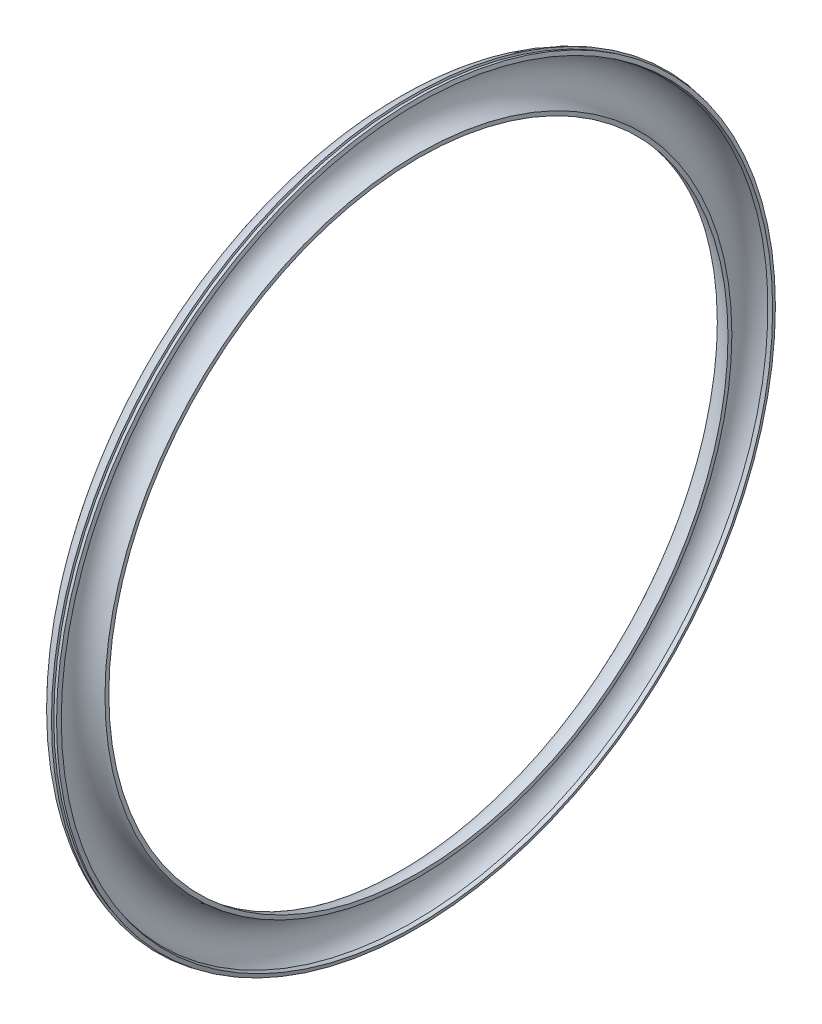
ISO-10303-21;
HEADER;
FILE_DESCRIPTION(('STEP AP214'),'2;1');
FILE_NAME('part.step','',(''),(''),'','','');
FILE_SCHEMA(('AUTOMOTIVE_DESIGN { 1 0 10303 214 1 1 1 1 }'));
ENDSEC;
DATA;
#1=APPLICATION_CONTEXT('core data for automotive mechanical design processes');
#2=APPLICATION_PROTOCOL_DEFINITION('international standard','automotive_design',2000,#1);
#3=PRODUCT_CONTEXT('',#1,'mechanical');
#4=PRODUCT('Part','Part','',(#3));
#5=PRODUCT_RELATED_PRODUCT_CATEGORY('part','',(#4));
#6=PRODUCT_DEFINITION_FORMATION('','',#4);
#7=PRODUCT_DEFINITION_CONTEXT('part definition',#1,'design');
#8=PRODUCT_DEFINITION('design','',#6,#7);
#9=PRODUCT_DEFINITION_SHAPE('','',#8);
#10=(LENGTH_UNIT() NAMED_UNIT(*) SI_UNIT(.MILLI.,.METRE.));
#11=(NAMED_UNIT(*) PLANE_ANGLE_UNIT() SI_UNIT($,.RADIAN.));
#12=(NAMED_UNIT(*) SI_UNIT($,.STERADIAN.) SOLID_ANGLE_UNIT());
#13=UNCERTAINTY_MEASURE_WITH_UNIT(LENGTH_MEASURE(1.E-05),#10,'distance_accuracy_value','');
#14=(GEOMETRIC_REPRESENTATION_CONTEXT(3) GLOBAL_UNCERTAINTY_ASSIGNED_CONTEXT((#13)) GLOBAL_UNIT_ASSIGNED_CONTEXT((#10,
#11,#12)) REPRESENTATION_CONTEXT('',''));
#15=CARTESIAN_POINT('',(0.,0.,0.));
#16=DIRECTION('',(0.,0.,1.));
#17=DIRECTION('',(1.,0.,0.));
#18=AXIS2_PLACEMENT_3D('',#15,#16,#17);
#19=CARTESIAN_POINT('',(0.,0.,0.));
#20=DIRECTION('',(-1.,0.,0.));
#21=DIRECTION('',(0.,0.,1.));
#22=AXIS2_PLACEMENT_3D('',#19,#20,#21);
#23=TOROIDAL_SURFACE('',#22,260.,20.);
#24=CARTESIAN_POINT('',(0.,0.,0.));
#25=DIRECTION('',(-1.,0.,0.));
#26=DIRECTION('',(0.,0.,1.));
#27=AXIS2_PLACEMENT_3D('',#24,#25,#26);
#28=CIRCLE('',#27,240.);
#29=CARTESIAN_POINT('',(0.,0.,240.));
#30=VERTEX_POINT('',#29);
#31=EDGE_CURVE('E76',#30,#30,#28,.T.);
#32=ORIENTED_EDGE('',*,*,#31,.F.);
#33=EDGE_LOOP('',(#32));
#34=FACE_BOUND('',#33,.T.);
#35=CARTESIAN_POINT('',(-5.17638090205044,0.,0.));
#36=DIRECTION('',(-1.,0.,0.));
#37=DIRECTION('',(0.,0.,1.));
#38=AXIS2_PLACEMENT_3D('',#35,#36,#37);
#39=CIRCLE('',#38,279.318516525781);
#40=CARTESIAN_POINT('',(-5.17638090205044,0.,279.318516525781));
#41=VERTEX_POINT('',#40);
#42=EDGE_CURVE('E10',#41,#41,#39,.T.);
#43=ORIENTED_EDGE('',*,*,#42,.T.);
#44=EDGE_LOOP('',(#43));
#45=FACE_BOUND('',#44,.T.);
#46=ADVANCED_FACE('F41',(#34,#45),#23,.T.);
#47=CARTESIAN_POINT('',(-4.78815233439667,0.,0.));
#48=DIRECTION('',(-1.,0.,0.));
#49=DIRECTION('',(0.,0.,1.));
#50=AXIS2_PLACEMENT_3D('',#47,#48,#49);
#51=CONICAL_SURFACE('',#50,277.869627786348,1.30899693899575);
#52=ORIENTED_EDGE('',*,*,#42,.F.);
#53=EDGE_LOOP('',(#52));
#54=FACE_BOUND('',#53,.T.);
#55=CARTESIAN_POINT('',(-4.78815233439667,0.,0.));
#56=DIRECTION('',(-1.,0.,0.));
#57=DIRECTION('',(0.,0.,1.));
#58=AXIS2_PLACEMENT_3D('',#55,#56,#57);
#59=CIRCLE('',#58,277.869627786348);
#60=CARTESIAN_POINT('',(-4.78815233439667,0.,277.869627786348));
#61=VERTEX_POINT('',#60);
#62=EDGE_CURVE('E48',#61,#61,#59,.T.);
#63=ORIENTED_EDGE('',*,*,#62,.T.);
#64=EDGE_LOOP('',(#63));
#65=FACE_BOUND('',#64,.T.);
#66=ADVANCED_FACE('F84',(#54,#65),#51,.T.);
#67=CARTESIAN_POINT('',(-1.89037485552943,0.,0.));
#68=DIRECTION('',(1.,0.,0.));
#69=DIRECTION('',(0.,0.,-1.));
#70=AXIS2_PLACEMENT_3D('',#67,#68,#69);
#71=CONICAL_SURFACE('',#70,278.646084921655,0.261799387799161);
#72=ORIENTED_EDGE('',*,*,#62,.F.);
#73=EDGE_LOOP('',(#72));
#74=FACE_BOUND('',#73,.T.);
#75=CARTESIAN_POINT('',(-1.89037485552943,0.,0.));
#76=DIRECTION('',(-1.,0.,0.));
#77=DIRECTION('',(0.,0.,1.));
#78=AXIS2_PLACEMENT_3D('',#75,#76,#77);
#79=CIRCLE('',#78,278.646084921655);
#80=CARTESIAN_POINT('',(-1.89037485552943,0.,278.646084921655));
#81=VERTEX_POINT('',#80);
#82=EDGE_CURVE('E53',#81,#81,#79,.T.);
#83=ORIENTED_EDGE('',*,*,#82,.T.);
#84=EDGE_LOOP('',(#83));
#85=FACE_BOUND('',#84,.T.);
#86=ADVANCED_FACE('F88',(#74,#85),#71,.T.);
#87=CARTESIAN_POINT('',(-1.11391772022187,0.,0.));
#88=DIRECTION('',(-1.,0.,0.));
#89=DIRECTION('',(0.,0.,1.));
#90=AXIS2_PLACEMENT_3D('',#87,#88,#89);
#91=CONICAL_SURFACE('',#90,275.748307442788,1.30899693899575);
#92=ORIENTED_EDGE('',*,*,#82,.F.);
#93=EDGE_LOOP('',(#92));
#94=FACE_BOUND('',#93,.T.);
#95=CARTESIAN_POINT('',(-1.11391772022187,0.,0.));
#96=DIRECTION('',(-1.,0.,0.));
#97=DIRECTION('',(0.,0.,1.));
#98=AXIS2_PLACEMENT_3D('',#95,#96,#97);
#99=CIRCLE('',#98,275.748307442788);
#100=CARTESIAN_POINT('',(-1.11391772022187,0.,275.748307442788));
#101=VERTEX_POINT('',#100);
#102=EDGE_CURVE('E58',#101,#101,#99,.T.);
#103=ORIENTED_EDGE('',*,*,#102,.T.);
#104=EDGE_LOOP('',(#103));
#105=FACE_BOUND('',#104,.T.);
#106=ADVANCED_FACE('F93',(#94,#105),#91,.T.);
#107=CARTESIAN_POINT('',(-4.01169519908909,0.,0.));
#108=DIRECTION('',(1.,0.,0.));
#109=DIRECTION('',(0.,0.,-1.));
#110=AXIS2_PLACEMENT_3D('',#107,#108,#109);
#111=CONICAL_SURFACE('',#110,274.971850307481,0.261799387799163);
#112=ORIENTED_EDGE('',*,*,#102,.F.);
#113=EDGE_LOOP('',(#112));
#114=FACE_BOUND('',#113,.T.);
#115=CARTESIAN_POINT('',(-4.01169519908909,0.,0.));
#116=DIRECTION('',(-1.,0.,0.));
#117=DIRECTION('',(0.,0.,1.));
#118=AXIS2_PLACEMENT_3D('',#115,#116,#117);
#119=CIRCLE('',#118,274.971850307481);
#120=CARTESIAN_POINT('',(-4.01169519908909,0.,274.971850307481));
#121=VERTEX_POINT('',#120);
#122=EDGE_CURVE('E64',#121,#121,#119,.T.);
#123=ORIENTED_EDGE('',*,*,#122,.T.);
#124=EDGE_LOOP('',(#123));
#125=FACE_BOUND('',#124,.T.);
#126=ADVANCED_FACE('F99',(#114,#125),#111,.F.);
#127=CARTESIAN_POINT('',(-4.39992376674289,0.,0.));
#128=DIRECTION('',(-1.,0.,0.));
#129=DIRECTION('',(0.,0.,1.));
#130=AXIS2_PLACEMENT_3D('',#127,#128,#129);
#131=CONICAL_SURFACE('',#130,276.420739046914,1.30899693899573);
#132=ORIENTED_EDGE('',*,*,#122,.F.);
#133=EDGE_LOOP('',(#132));
#134=FACE_BOUND('',#133,.T.);
#135=CARTESIAN_POINT('',(-4.39992376674289,0.,0.));
#136=DIRECTION('',(-1.,0.,0.));
#137=DIRECTION('',(0.,0.,1.));
#138=AXIS2_PLACEMENT_3D('',#135,#136,#137);
#139=CIRCLE('',#138,276.420739046914);
#140=CARTESIAN_POINT('',(-4.39992376674289,0.,276.420739046914));
#141=VERTEX_POINT('',#140);
#142=EDGE_CURVE('E68',#141,#141,#139,.T.);
#143=ORIENTED_EDGE('',*,*,#142,.T.);
#144=EDGE_LOOP('',(#143));
#145=FACE_BOUND('',#144,.T.);
#146=ADVANCED_FACE('F103',(#134,#145),#131,.F.);
#147=CARTESIAN_POINT('',(0.,0.,0.));
#148=DIRECTION('',(-1.,0.,0.));
#149=DIRECTION('',(0.,0.,1.));
#150=AXIS2_PLACEMENT_3D('',#147,#148,#149);
#151=TOROIDAL_SURFACE('',#150,260.,17.);
#152=ORIENTED_EDGE('',*,*,#142,.F.);
#153=EDGE_LOOP('',(#152));
#154=FACE_BOUND('',#153,.T.);
#155=CARTESIAN_POINT('',(0.,0.,0.));
#156=DIRECTION('',(-1.,0.,0.));
#157=DIRECTION('',(0.,0.,1.));
#158=AXIS2_PLACEMENT_3D('',#155,#156,#157);
#159=CIRCLE('',#158,243.);
#160=CARTESIAN_POINT('',(0.,0.,243.));
#161=VERTEX_POINT('',#160);
#162=EDGE_CURVE('E72',#161,#161,#159,.T.);
#163=ORIENTED_EDGE('',*,*,#162,.T.);
#164=EDGE_LOOP('',(#163));
#165=FACE_BOUND('',#164,.T.);
#166=ADVANCED_FACE('F107',(#154,#165),#151,.F.);
#167=CARTESIAN_POINT('',(0.,243.,0.));
#168=DIRECTION('',(-1.,0.,0.));
#169=DIRECTION('',(0.,0.,1.));
#170=AXIS2_PLACEMENT_3D('',#167,#168,#169);
#171=PLANE('',#170);
#172=ORIENTED_EDGE('',*,*,#162,.F.);
#173=EDGE_LOOP('',(#172));
#174=FACE_BOUND('',#173,.T.);
#175=ORIENTED_EDGE('',*,*,#31,.T.);
#176=EDGE_LOOP('',(#175));
#177=FACE_BOUND('',#176,.T.);
#178=ADVANCED_FACE('F81',(#174,#177),#171,.F.);
#179=CLOSED_SHELL('',(#46,#66,#86,#106,#126,#146,#166,#178));
#180=MANIFOLD_SOLID_BREP('B2',#179);
#181=ADVANCED_BREP_SHAPE_REPRESENTATION('',(#18,#180),#14);
#182=SHAPE_DEFINITION_REPRESENTATION(#9,#181);
ENDSEC;
END-ISO-10303-21;
